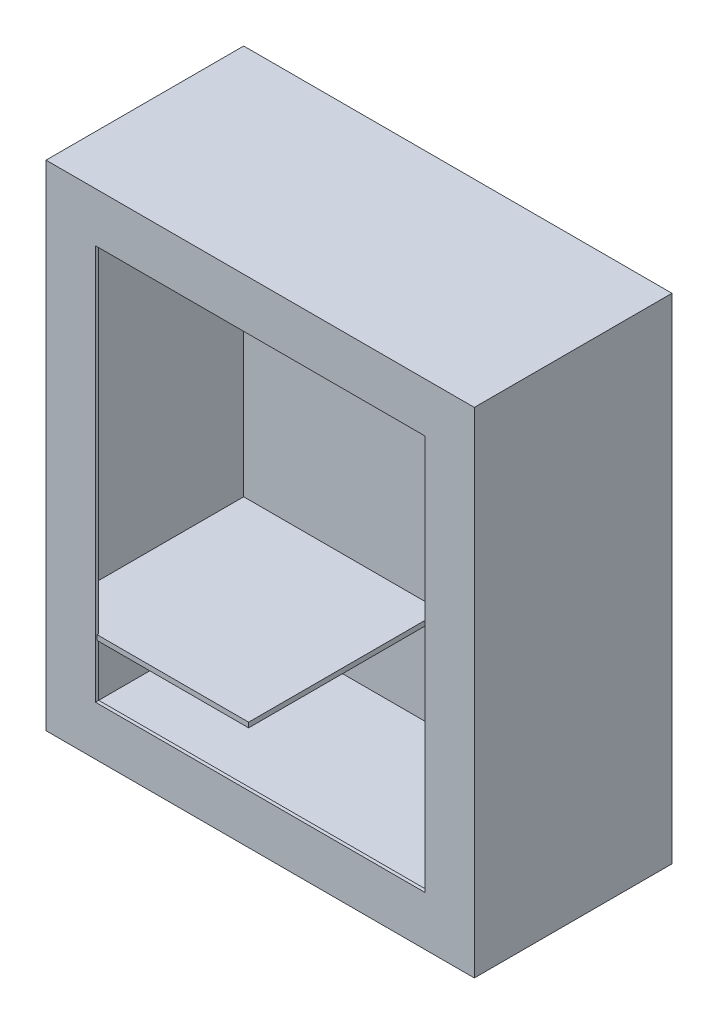
ISO-10303-21;
HEADER;
FILE_DESCRIPTION(('STEP AP214'),'2;1');
FILE_NAME('part.step','',(''),(''),'','','');
FILE_SCHEMA(('AUTOMOTIVE_DESIGN { 1 0 10303 214 1 1 1 1 }'));
ENDSEC;
DATA;
#1=APPLICATION_CONTEXT('core data for automotive mechanical design processes');
#2=APPLICATION_PROTOCOL_DEFINITION('international standard','automotive_design',2000,#1);
#3=PRODUCT_CONTEXT('',#1,'mechanical');
#4=PRODUCT('Part','Part','',(#3));
#5=PRODUCT_RELATED_PRODUCT_CATEGORY('part','',(#4));
#6=PRODUCT_DEFINITION_FORMATION('','',#4);
#7=PRODUCT_DEFINITION_CONTEXT('part definition',#1,'design');
#8=PRODUCT_DEFINITION('design','',#6,#7);
#9=PRODUCT_DEFINITION_SHAPE('','',#8);
#10=(LENGTH_UNIT() NAMED_UNIT(*) SI_UNIT(.MILLI.,.METRE.));
#11=(NAMED_UNIT(*) PLANE_ANGLE_UNIT() SI_UNIT($,.RADIAN.));
#12=(NAMED_UNIT(*) SI_UNIT($,.STERADIAN.) SOLID_ANGLE_UNIT());
#13=UNCERTAINTY_MEASURE_WITH_UNIT(LENGTH_MEASURE(1.E-05),#10,'distance_accuracy_value','');
#14=(GEOMETRIC_REPRESENTATION_CONTEXT(3) GLOBAL_UNCERTAINTY_ASSIGNED_CONTEXT((#13)) GLOBAL_UNIT_ASSIGNED_CONTEXT((#10,
#11,#12)) REPRESENTATION_CONTEXT('',''));
#15=CARTESIAN_POINT('',(0.,0.,0.));
#16=DIRECTION('',(0.,0.,1.));
#17=DIRECTION('',(1.,0.,0.));
#18=AXIS2_PLACEMENT_3D('',#15,#16,#17);
#19=CARTESIAN_POINT('',(-100.,120.,118.));
#20=DIRECTION('',(-1.,0.,0.));
#21=DIRECTION('',(0.,-1.,0.));
#22=AXIS2_PLACEMENT_3D('',#19,#20,#21);
#23=PLANE('',#22);
#24=DIRECTION('',(0.,0.,1.));
#25=VECTOR('',#24,1.);
#26=CARTESIAN_POINT('',(-100.,-85.,118.));
#27=LINE('',#26,#25);
#28=CARTESIAN_POINT('',(-100.,-85.,118.));
#29=VERTEX_POINT('',#28);
#30=CARTESIAN_POINT('',(-100.,-85.,119.));
#31=VERTEX_POINT('',#30);
#32=EDGE_CURVE('E221',#29,#31,#27,.T.);
#33=ORIENTED_EDGE('',*,*,#32,.F.);
#34=DIRECTION('',(0.,-1.,0.));
#35=VECTOR('',#34,1.);
#36=CARTESIAN_POINT('',(-100.,120.,118.));
#37=LINE('',#36,#35);
#38=CARTESIAN_POINT('',(-100.,120.,118.));
#39=VERTEX_POINT('',#38);
#40=EDGE_CURVE('E269',#39,#29,#37,.T.);
#41=ORIENTED_EDGE('',*,*,#40,.F.);
#42=DIRECTION('',(0.,0.,1.));
#43=VECTOR('',#42,1.);
#44=CARTESIAN_POINT('',(-100.,120.,118.));
#45=LINE('',#44,#43);
#46=CARTESIAN_POINT('',(-100.,120.,120.));
#47=VERTEX_POINT('',#46);
#48=EDGE_CURVE('E298',#39,#47,#45,.T.);
#49=ORIENTED_EDGE('',*,*,#48,.T.);
#50=DIRECTION('',(0.,-1.,0.));
#51=VECTOR('',#50,1.);
#52=CARTESIAN_POINT('',(-100.,120.,120.));
#53=LINE('',#52,#51);
#54=CARTESIAN_POINT('',(-100.,-120.,120.));
#55=VERTEX_POINT('',#54);
#56=EDGE_CURVE('E259',#47,#55,#53,.T.);
#57=ORIENTED_EDGE('',*,*,#56,.T.);
#58=DIRECTION('',(0.,0.,1.));
#59=VECTOR('',#58,1.);
#60=CARTESIAN_POINT('',(-100.,-120.,118.));
#61=LINE('',#60,#59);
#62=CARTESIAN_POINT('',(-100.,-120.,118.));
#63=VERTEX_POINT('',#62);
#64=EDGE_CURVE('E283',#63,#55,#61,.T.);
#65=ORIENTED_EDGE('',*,*,#64,.F.);
#66=CARTESIAN_POINT('',(-100.,-88.0000000000001,118.));
#67=VERTEX_POINT('',#66);
#68=EDGE_CURVE('E274',#67,#63,#37,.T.);
#69=ORIENTED_EDGE('',*,*,#68,.F.);
#70=DIRECTION('',(0.,0.,-1.));
#71=VECTOR('',#70,1.);
#72=CARTESIAN_POINT('',(-100.,-88.,118.));
#73=LINE('',#72,#71);
#74=CARTESIAN_POINT('',(-100.,-88.,119.));
#75=VERTEX_POINT('',#74);
#76=EDGE_CURVE('E58',#75,#67,#73,.T.);
#77=ORIENTED_EDGE('',*,*,#76,.F.);
#78=DIRECTION('',(0.,-1.,0.));
#79=VECTOR('',#78,1.);
#80=CARTESIAN_POINT('',(-100.,120.,119.));
#81=LINE('',#80,#79);
#82=EDGE_CURVE('E11',#31,#75,#81,.T.);
#83=ORIENTED_EDGE('',*,*,#82,.F.);
#84=EDGE_LOOP('',(#33,#41,#49,#57,#65,#69,#77,#83));
#85=FACE_BOUND('',#84,.T.);
#86=ADVANCED_FACE('F39',(#85),#23,.F.);
#87=CARTESIAN_POINT('',(0.,0.,118.));
#88=DIRECTION('',(0.,0.,-1.));
#89=DIRECTION('',(-1.,0.,0.));
#90=AXIS2_PLACEMENT_3D('',#87,#88,#89);
#91=PLANE('',#90);
#92=ORIENTED_EDGE('',*,*,#40,.T.);
#93=DIRECTION('',(-1.,0.,0.));
#94=VECTOR('',#93,1.);
#95=CARTESIAN_POINT('',(0.,-85.,118.));
#96=LINE('',#95,#94);
#97=CARTESIAN_POINT('',(-128.,-85.,118.));
#98=VERTEX_POINT('',#97);
#99=EDGE_CURVE('E218',#29,#98,#96,.T.);
#100=ORIENTED_EDGE('',*,*,#99,.T.);
#101=DIRECTION('',(0.,-1.,0.));
#102=VECTOR('',#101,1.);
#103=CARTESIAN_POINT('',(-128.,148.,118.));
#104=LINE('',#103,#102);
#105=CARTESIAN_POINT('',(-128.,148.,118.));
#106=VERTEX_POINT('',#105);
#107=EDGE_CURVE('E240',#106,#98,#104,.T.);
#108=ORIENTED_EDGE('',*,*,#107,.F.);
#109=DIRECTION('',(-1.,0.,0.));
#110=VECTOR('',#109,1.);
#111=CARTESIAN_POINT('',(128.,148.,118.));
#112=LINE('',#111,#110);
#113=CARTESIAN_POINT('',(128.,148.,118.));
#114=VERTEX_POINT('',#113);
#115=EDGE_CURVE('E252',#114,#106,#112,.T.);
#116=ORIENTED_EDGE('',*,*,#115,.F.);
#117=DIRECTION('',(0.,1.,0.));
#118=VECTOR('',#117,1.);
#119=CARTESIAN_POINT('',(128.,148.,118.));
#120=LINE('',#119,#118);
#121=CARTESIAN_POINT('',(128.,-148.,118.));
#122=VERTEX_POINT('',#121);
#123=EDGE_CURVE('E248',#122,#114,#120,.T.);
#124=ORIENTED_EDGE('',*,*,#123,.F.);
#125=DIRECTION('',(1.,0.,0.));
#126=VECTOR('',#125,1.);
#127=CARTESIAN_POINT('',(128.,-148.,118.));
#128=LINE('',#127,#126);
#129=CARTESIAN_POINT('',(-128.,-148.,118.));
#130=VERTEX_POINT('',#129);
#131=EDGE_CURVE('E244',#130,#122,#128,.T.);
#132=ORIENTED_EDGE('',*,*,#131,.F.);
#133=CARTESIAN_POINT('',(-128.,-88.,118.));
#134=VERTEX_POINT('',#133);
#135=EDGE_CURVE('E224',#134,#130,#104,.T.);
#136=ORIENTED_EDGE('',*,*,#135,.F.);
#137=DIRECTION('',(1.,0.,0.));
#138=VECTOR('',#137,1.);
#139=CARTESIAN_POINT('',(0.,-88.,118.));
#140=LINE('',#139,#138);
#141=EDGE_CURVE('E174',#134,#67,#140,.T.);
#142=ORIENTED_EDGE('',*,*,#141,.T.);
#143=ORIENTED_EDGE('',*,*,#68,.T.);
#144=DIRECTION('',(1.,0.,0.));
#145=VECTOR('',#144,1.);
#146=CARTESIAN_POINT('',(100.,-120.,118.));
#147=LINE('',#146,#145);
#148=CARTESIAN_POINT('',(100.,-120.,118.));
#149=VERTEX_POINT('',#148);
#150=EDGE_CURVE('E273',#63,#149,#147,.T.);
#151=ORIENTED_EDGE('',*,*,#150,.T.);
#152=DIRECTION('',(0.,1.,0.));
#153=VECTOR('',#152,1.);
#154=CARTESIAN_POINT('',(100.,120.,118.));
#155=LINE('',#154,#153);
#156=CARTESIAN_POINT('',(100.,120.,118.));
#157=VERTEX_POINT('',#156);
#158=EDGE_CURVE('E277',#149,#157,#155,.T.);
#159=ORIENTED_EDGE('',*,*,#158,.T.);
#160=DIRECTION('',(-1.,0.,0.));
#161=VECTOR('',#160,1.);
#162=CARTESIAN_POINT('',(100.,120.,118.));
#163=LINE('',#162,#161);
#164=EDGE_CURVE('E280',#157,#39,#163,.T.);
#165=ORIENTED_EDGE('',*,*,#164,.T.);
#166=EDGE_LOOP('',(#92,#100,#108,#116,#124,#132,#136,#142,#143,#151,#159,#165));
#167=FACE_BOUND('',#166,.T.);
#168=ADVANCED_FACE('F383',(#167),#91,.T.);
#169=CARTESIAN_POINT('',(-128.,148.,2.));
#170=DIRECTION('',(-1.,0.,0.));
#171=DIRECTION('',(0.,-1.,0.));
#172=AXIS2_PLACEMENT_3D('',#169,#170,#171);
#173=PLANE('',#172);
#174=DIRECTION('',(0.,0.,1.));
#175=VECTOR('',#174,1.);
#176=CARTESIAN_POINT('',(-128.,-85.,2.));
#177=LINE('',#176,#175);
#178=CARTESIAN_POINT('',(-128.,-85.,2.));
#179=VERTEX_POINT('',#178);
#180=EDGE_CURVE('E196',#179,#98,#177,.T.);
#181=ORIENTED_EDGE('',*,*,#180,.F.);
#182=DIRECTION('',(0.,-1.,0.));
#183=VECTOR('',#182,1.);
#184=CARTESIAN_POINT('',(-128.,148.,2.));
#185=LINE('',#184,#183);
#186=CARTESIAN_POINT('',(-128.,148.,2.));
#187=VERTEX_POINT('',#186);
#188=EDGE_CURVE('E170',#187,#179,#185,.T.);
#189=ORIENTED_EDGE('',*,*,#188,.F.);
#190=DIRECTION('',(0.,0.,1.));
#191=VECTOR('',#190,1.);
#192=CARTESIAN_POINT('',(-128.,148.,2.));
#193=LINE('',#192,#191);
#194=EDGE_CURVE('E256',#187,#106,#193,.T.);
#195=ORIENTED_EDGE('',*,*,#194,.T.);
#196=ORIENTED_EDGE('',*,*,#107,.T.);
#197=EDGE_LOOP('',(#181,#189,#195,#196));
#198=FACE_BOUND('',#197,.T.);
#199=ADVANCED_FACE('F388',(#198),#173,.F.);
#200=DIRECTION('',(0.,0.,-1.));
#201=VECTOR('',#200,1.);
#202=CARTESIAN_POINT('',(-128.,-88.,2.));
#203=LINE('',#202,#201);
#204=CARTESIAN_POINT('',(-128.,-88.0000000000001,2.));
#205=VERTEX_POINT('',#204);
#206=EDGE_CURVE('E192',#134,#205,#203,.T.);
#207=ORIENTED_EDGE('',*,*,#206,.F.);
#208=ORIENTED_EDGE('',*,*,#135,.T.);
#209=DIRECTION('',(0.,0.,1.));
#210=VECTOR('',#209,1.);
#211=CARTESIAN_POINT('',(-128.,-148.,2.));
#212=LINE('',#211,#210);
#213=CARTESIAN_POINT('',(-128.,-148.,2.));
#214=VERTEX_POINT('',#213);
#215=EDGE_CURVE('E239',#214,#130,#212,.T.);
#216=ORIENTED_EDGE('',*,*,#215,.F.);
#217=EDGE_CURVE('E228',#205,#214,#185,.T.);
#218=ORIENTED_EDGE('',*,*,#217,.F.);
#219=EDGE_LOOP('',(#207,#208,#216,#218));
#220=FACE_BOUND('',#219,.T.);
#221=ADVANCED_FACE('F406',(#220),#173,.F.);
#222=CARTESIAN_POINT('',(0.,0.,2.));
#223=DIRECTION('',(0.,0.,-1.));
#224=DIRECTION('',(-1.,0.,0.));
#225=AXIS2_PLACEMENT_3D('',#222,#223,#224);
#226=PLANE('',#225);
#227=DIRECTION('',(-1.,0.,0.));
#228=VECTOR('',#227,1.);
#229=CARTESIAN_POINT('',(-7.99999999999992,-85.,2.));
#230=LINE('',#229,#228);
#231=CARTESIAN_POINT('',(-7.99999999999992,-85.,2.));
#232=VERTEX_POINT('',#231);
#233=EDGE_CURVE('E162',#232,#179,#230,.T.);
#234=ORIENTED_EDGE('',*,*,#233,.F.);
#235=DIRECTION('',(0.,1.,0.));
#236=VECTOR('',#235,1.);
#237=CARTESIAN_POINT('',(-7.99999999999992,-85.,2.));
#238=LINE('',#237,#236);
#239=CARTESIAN_POINT('',(-7.99999999999992,-88.,2.));
#240=VERTEX_POINT('',#239);
#241=EDGE_CURVE('E166',#240,#232,#238,.T.);
#242=ORIENTED_EDGE('',*,*,#241,.F.);
#243=DIRECTION('',(-1.,0.,0.));
#244=VECTOR('',#243,1.);
#245=CARTESIAN_POINT('',(-7.99999999999992,-88.,2.));
#246=LINE('',#245,#244);
#247=EDGE_CURVE('E203',#240,#205,#246,.T.);
#248=ORIENTED_EDGE('',*,*,#247,.T.);
#249=ORIENTED_EDGE('',*,*,#217,.T.);
#250=DIRECTION('',(1.,0.,0.));
#251=VECTOR('',#250,1.);
#252=CARTESIAN_POINT('',(128.,-148.,2.));
#253=LINE('',#252,#251);
#254=CARTESIAN_POINT('',(128.,-148.,2.));
#255=VERTEX_POINT('',#254);
#256=EDGE_CURVE('E227',#214,#255,#253,.T.);
#257=ORIENTED_EDGE('',*,*,#256,.T.);
#258=DIRECTION('',(0.,1.,0.));
#259=VECTOR('',#258,1.);
#260=CARTESIAN_POINT('',(128.,148.,2.));
#261=LINE('',#260,#259);
#262=CARTESIAN_POINT('',(128.,148.,2.));
#263=VERTEX_POINT('',#262);
#264=EDGE_CURVE('E232',#255,#263,#261,.T.);
#265=ORIENTED_EDGE('',*,*,#264,.T.);
#266=DIRECTION('',(-1.,0.,0.));
#267=VECTOR('',#266,1.);
#268=CARTESIAN_POINT('',(128.,148.,2.));
#269=LINE('',#268,#267);
#270=EDGE_CURVE('E236',#263,#187,#269,.T.);
#271=ORIENTED_EDGE('',*,*,#270,.T.);
#272=ORIENTED_EDGE('',*,*,#188,.T.);
#273=EDGE_LOOP('',(#234,#242,#248,#249,#257,#265,#271,#272));
#274=FACE_BOUND('',#273,.T.);
#275=ADVANCED_FACE('F164',(#274),#226,.F.);
#276=CARTESIAN_POINT('',(-130.,150.,120.));
#277=DIRECTION('',(1.,0.,0.));
#278=DIRECTION('',(0.,1.,0.));
#279=AXIS2_PLACEMENT_3D('',#276,#277,#278);
#280=PLANE('',#279);
#281=DIRECTION('',(0.,-1.,0.));
#282=VECTOR('',#281,1.);
#283=CARTESIAN_POINT('',(-130.,150.,0.));
#284=LINE('',#283,#282);
#285=CARTESIAN_POINT('',(-130.,150.,0.));
#286=VERTEX_POINT('',#285);
#287=CARTESIAN_POINT('',(-130.,-150.,0.));
#288=VERTEX_POINT('',#287);
#289=EDGE_CURVE('E301',#286,#288,#284,.T.);
#290=ORIENTED_EDGE('',*,*,#289,.T.);
#291=DIRECTION('',(0.,0.,-1.));
#292=VECTOR('',#291,1.);
#293=CARTESIAN_POINT('',(-130.,-150.,120.));
#294=LINE('',#293,#292);
#295=CARTESIAN_POINT('',(-130.,-150.,120.));
#296=VERTEX_POINT('',#295);
#297=EDGE_CURVE('E48',#296,#288,#294,.T.);
#298=ORIENTED_EDGE('',*,*,#297,.F.);
#299=DIRECTION('',(0.,-1.,0.));
#300=VECTOR('',#299,1.);
#301=CARTESIAN_POINT('',(-130.,150.,120.));
#302=LINE('',#301,#300);
#303=CARTESIAN_POINT('',(-130.,150.,120.));
#304=VERTEX_POINT('',#303);
#305=EDGE_CURVE('E311',#304,#296,#302,.T.);
#306=ORIENTED_EDGE('',*,*,#305,.F.);
#307=DIRECTION('',(0.,0.,-1.));
#308=VECTOR('',#307,1.);
#309=CARTESIAN_POINT('',(-130.,150.,120.));
#310=LINE('',#309,#308);
#311=EDGE_CURVE('E325',#304,#286,#310,.T.);
#312=ORIENTED_EDGE('',*,*,#311,.T.);
#313=EDGE_LOOP('',(#290,#298,#306,#312));
#314=FACE_BOUND('',#313,.T.);
#315=ADVANCED_FACE('F41',(#314),#280,.F.);
#316=CARTESIAN_POINT('',(130.,-150.,120.));
#317=DIRECTION('',(0.,1.,0.));
#318=DIRECTION('',(0.,0.,1.));
#319=AXIS2_PLACEMENT_3D('',#316,#317,#318);
#320=PLANE('',#319);
#321=DIRECTION('',(1.,0.,0.));
#322=VECTOR('',#321,1.);
#323=CARTESIAN_POINT('',(130.,-150.,0.));
#324=LINE('',#323,#322);
#325=CARTESIAN_POINT('',(130.,-150.,0.));
#326=VERTEX_POINT('',#325);
#327=EDGE_CURVE('E329',#288,#326,#324,.T.);
#328=ORIENTED_EDGE('',*,*,#327,.T.);
#329=DIRECTION('',(0.,0.,-1.));
#330=VECTOR('',#329,1.);
#331=CARTESIAN_POINT('',(130.,-150.,120.));
#332=LINE('',#331,#330);
#333=CARTESIAN_POINT('',(130.,-150.,120.));
#334=VERTEX_POINT('',#333);
#335=EDGE_CURVE('E344',#334,#326,#332,.T.);
#336=ORIENTED_EDGE('',*,*,#335,.F.);
#337=DIRECTION('',(1.,0.,0.));
#338=VECTOR('',#337,1.);
#339=CARTESIAN_POINT('',(130.,-150.,120.));
#340=LINE('',#339,#338);
#341=EDGE_CURVE('E315',#296,#334,#340,.T.);
#342=ORIENTED_EDGE('',*,*,#341,.F.);
#343=ORIENTED_EDGE('',*,*,#297,.T.);
#344=EDGE_LOOP('',(#328,#336,#342,#343));
#345=FACE_BOUND('',#344,.T.);
#346=ADVANCED_FACE('F351',(#345),#320,.F.);
#347=CARTESIAN_POINT('',(130.,150.,120.));
#348=DIRECTION('',(-1.,0.,0.));
#349=DIRECTION('',(0.,-1.,0.));
#350=AXIS2_PLACEMENT_3D('',#347,#348,#349);
#351=PLANE('',#350);
#352=DIRECTION('',(0.,1.,0.));
#353=VECTOR('',#352,1.);
#354=CARTESIAN_POINT('',(130.,150.,0.));
#355=LINE('',#354,#353);
#356=CARTESIAN_POINT('',(130.,150.,0.));
#357=VERTEX_POINT('',#356);
#358=EDGE_CURVE('E332',#326,#357,#355,.T.);
#359=ORIENTED_EDGE('',*,*,#358,.T.);
#360=DIRECTION('',(0.,0.,-1.));
#361=VECTOR('',#360,1.);
#362=CARTESIAN_POINT('',(130.,150.,120.));
#363=LINE('',#362,#361);
#364=CARTESIAN_POINT('',(130.,150.,120.));
#365=VERTEX_POINT('',#364);
#366=EDGE_CURVE('E340',#365,#357,#363,.T.);
#367=ORIENTED_EDGE('',*,*,#366,.F.);
#368=DIRECTION('',(0.,1.,0.));
#369=VECTOR('',#368,1.);
#370=CARTESIAN_POINT('',(130.,150.,120.));
#371=LINE('',#370,#369);
#372=EDGE_CURVE('E319',#334,#365,#371,.T.);
#373=ORIENTED_EDGE('',*,*,#372,.F.);
#374=ORIENTED_EDGE('',*,*,#335,.T.);
#375=EDGE_LOOP('',(#359,#367,#373,#374));
#376=FACE_BOUND('',#375,.T.);
#377=ADVANCED_FACE('F363',(#376),#351,.F.);
#378=CARTESIAN_POINT('',(130.,150.,120.));
#379=DIRECTION('',(0.,-1.,0.));
#380=DIRECTION('',(1.,0.,0.));
#381=AXIS2_PLACEMENT_3D('',#378,#379,#380);
#382=PLANE('',#381);
#383=DIRECTION('',(-1.,0.,0.));
#384=VECTOR('',#383,1.);
#385=CARTESIAN_POINT('',(130.,150.,0.));
#386=LINE('',#385,#384);
#387=EDGE_CURVE('E316',#357,#286,#386,.T.);
#388=ORIENTED_EDGE('',*,*,#387,.T.);
#389=ORIENTED_EDGE('',*,*,#311,.F.);
#390=DIRECTION('',(-1.,0.,0.));
#391=VECTOR('',#390,1.);
#392=CARTESIAN_POINT('',(130.,150.,120.));
#393=LINE('',#392,#391);
#394=EDGE_CURVE('E322',#365,#304,#393,.T.);
#395=ORIENTED_EDGE('',*,*,#394,.F.);
#396=ORIENTED_EDGE('',*,*,#366,.T.);
#397=EDGE_LOOP('',(#388,#389,#395,#396));
#398=FACE_BOUND('',#397,.T.);
#399=ADVANCED_FACE('F367',(#398),#382,.F.);
#400=CARTESIAN_POINT('',(0.,0.,120.));
#401=DIRECTION('',(0.,0.,-1.));
#402=DIRECTION('',(-1.,0.,0.));
#403=AXIS2_PLACEMENT_3D('',#400,#401,#402);
#404=PLANE('',#403);
#405=DIRECTION('',(1.,0.,0.));
#406=VECTOR('',#405,1.);
#407=CARTESIAN_POINT('',(100.,-120.,120.));
#408=LINE('',#407,#406);
#409=CARTESIAN_POINT('',(100.,-120.,120.));
#410=VERTEX_POINT('',#409);
#411=EDGE_CURVE('E286',#55,#410,#408,.T.);
#412=ORIENTED_EDGE('',*,*,#411,.F.);
#413=ORIENTED_EDGE('',*,*,#56,.F.);
#414=DIRECTION('',(-1.,0.,0.));
#415=VECTOR('',#414,1.);
#416=CARTESIAN_POINT('',(100.,120.,120.));
#417=LINE('',#416,#415);
#418=CARTESIAN_POINT('',(100.,120.,120.));
#419=VERTEX_POINT('',#418);
#420=EDGE_CURVE('E294',#419,#47,#417,.T.);
#421=ORIENTED_EDGE('',*,*,#420,.F.);
#422=DIRECTION('',(0.,1.,0.));
#423=VECTOR('',#422,1.);
#424=CARTESIAN_POINT('',(100.,120.,120.));
#425=LINE('',#424,#423);
#426=EDGE_CURVE('E290',#410,#419,#425,.T.);
#427=ORIENTED_EDGE('',*,*,#426,.F.);
#428=EDGE_LOOP('',(#412,#413,#421,#427));
#429=FACE_BOUND('',#428,.T.);
#430=ORIENTED_EDGE('',*,*,#305,.T.);
#431=ORIENTED_EDGE('',*,*,#341,.T.);
#432=ORIENTED_EDGE('',*,*,#372,.T.);
#433=ORIENTED_EDGE('',*,*,#394,.T.);
#434=EDGE_LOOP('',(#430,#431,#432,#433));
#435=FACE_BOUND('',#434,.T.);
#436=ADVANCED_FACE('F369',(#429,#435),#404,.F.);
#437=CARTESIAN_POINT('',(0.,0.,0.));
#438=DIRECTION('',(0.,0.,-1.));
#439=DIRECTION('',(-1.,0.,0.));
#440=AXIS2_PLACEMENT_3D('',#437,#438,#439);
#441=PLANE('',#440);
#442=ORIENTED_EDGE('',*,*,#289,.F.);
#443=ORIENTED_EDGE('',*,*,#387,.F.);
#444=ORIENTED_EDGE('',*,*,#358,.F.);
#445=ORIENTED_EDGE('',*,*,#327,.F.);
#446=EDGE_LOOP('',(#442,#443,#444,#445));
#447=FACE_BOUND('',#446,.T.);
#448=ADVANCED_FACE('F359',(#447),#441,.T.);
#449=CARTESIAN_POINT('',(100.,120.,118.));
#450=DIRECTION('',(0.,1.,0.));
#451=DIRECTION('',(-1.,0.,0.));
#452=AXIS2_PLACEMENT_3D('',#449,#450,#451);
#453=PLANE('',#452);
#454=ORIENTED_EDGE('',*,*,#420,.T.);
#455=ORIENTED_EDGE('',*,*,#48,.F.);
#456=ORIENTED_EDGE('',*,*,#164,.F.);
#457=DIRECTION('',(0.,0.,1.));
#458=VECTOR('',#457,1.);
#459=CARTESIAN_POINT('',(100.,120.,118.));
#460=LINE('',#459,#458);
#461=EDGE_CURVE('E302',#157,#419,#460,.T.);
#462=ORIENTED_EDGE('',*,*,#461,.T.);
#463=EDGE_LOOP('',(#454,#455,#456,#462));
#464=FACE_BOUND('',#463,.T.);
#465=ADVANCED_FACE('F377',(#464),#453,.F.);
#466=CARTESIAN_POINT('',(100.,120.,118.));
#467=DIRECTION('',(1.,0.,0.));
#468=DIRECTION('',(0.,1.,0.));
#469=AXIS2_PLACEMENT_3D('',#466,#467,#468);
#470=PLANE('',#469);
#471=ORIENTED_EDGE('',*,*,#426,.T.);
#472=ORIENTED_EDGE('',*,*,#461,.F.);
#473=ORIENTED_EDGE('',*,*,#158,.F.);
#474=DIRECTION('',(0.,0.,1.));
#475=VECTOR('',#474,1.);
#476=CARTESIAN_POINT('',(100.,-120.,118.));
#477=LINE('',#476,#475);
#478=EDGE_CURVE('E305',#149,#410,#477,.T.);
#479=ORIENTED_EDGE('',*,*,#478,.T.);
#480=EDGE_LOOP('',(#471,#472,#473,#479));
#481=FACE_BOUND('',#480,.T.);
#482=ADVANCED_FACE('F396',(#481),#470,.F.);
#483=CARTESIAN_POINT('',(100.,-120.,118.));
#484=DIRECTION('',(0.,-1.,0.));
#485=DIRECTION('',(1.,0.,0.));
#486=AXIS2_PLACEMENT_3D('',#483,#484,#485);
#487=PLANE('',#486);
#488=ORIENTED_EDGE('',*,*,#411,.T.);
#489=ORIENTED_EDGE('',*,*,#478,.F.);
#490=ORIENTED_EDGE('',*,*,#150,.F.);
#491=ORIENTED_EDGE('',*,*,#64,.T.);
#492=EDGE_LOOP('',(#488,#489,#490,#491));
#493=FACE_BOUND('',#492,.T.);
#494=ADVANCED_FACE('F392',(#493),#487,.F.);
#495=CARTESIAN_POINT('',(128.,148.,2.));
#496=DIRECTION('',(0.,1.,0.));
#497=DIRECTION('',(-1.,0.,0.));
#498=AXIS2_PLACEMENT_3D('',#495,#496,#497);
#499=PLANE('',#498);
#500=ORIENTED_EDGE('',*,*,#115,.T.);
#501=ORIENTED_EDGE('',*,*,#194,.F.);
#502=ORIENTED_EDGE('',*,*,#270,.F.);
#503=DIRECTION('',(0.,0.,1.));
#504=VECTOR('',#503,1.);
#505=CARTESIAN_POINT('',(128.,148.,2.));
#506=LINE('',#505,#504);
#507=EDGE_CURVE('E260',#263,#114,#506,.T.);
#508=ORIENTED_EDGE('',*,*,#507,.T.);
#509=EDGE_LOOP('',(#500,#501,#502,#508));
#510=FACE_BOUND('',#509,.T.);
#511=ADVANCED_FACE('F395',(#510),#499,.F.);
#512=CARTESIAN_POINT('',(128.,148.,2.));
#513=DIRECTION('',(1.,0.,0.));
#514=DIRECTION('',(0.,0.,-1.));
#515=AXIS2_PLACEMENT_3D('',#512,#513,#514);
#516=PLANE('',#515);
#517=ORIENTED_EDGE('',*,*,#123,.T.);
#518=ORIENTED_EDGE('',*,*,#507,.F.);
#519=ORIENTED_EDGE('',*,*,#264,.F.);
#520=DIRECTION('',(0.,0.,1.));
#521=VECTOR('',#520,1.);
#522=CARTESIAN_POINT('',(128.,-148.,2.));
#523=LINE('',#522,#521);
#524=EDGE_CURVE('E263',#255,#122,#523,.T.);
#525=ORIENTED_EDGE('',*,*,#524,.T.);
#526=EDGE_LOOP('',(#517,#518,#519,#525));
#527=FACE_BOUND('',#526,.T.);
#528=ADVANCED_FACE('F412',(#527),#516,.F.);
#529=CARTESIAN_POINT('',(128.,-148.,2.));
#530=DIRECTION('',(0.,-1.,0.));
#531=DIRECTION('',(1.,0.,0.));
#532=AXIS2_PLACEMENT_3D('',#529,#530,#531);
#533=PLANE('',#532);
#534=ORIENTED_EDGE('',*,*,#131,.T.);
#535=ORIENTED_EDGE('',*,*,#524,.F.);
#536=ORIENTED_EDGE('',*,*,#256,.F.);
#537=ORIENTED_EDGE('',*,*,#215,.T.);
#538=EDGE_LOOP('',(#534,#535,#536,#537));
#539=FACE_BOUND('',#538,.T.);
#540=ADVANCED_FACE('F408',(#539),#533,.F.);
#541=CARTESIAN_POINT('',(-7.99999999999992,-85.,119.));
#542=DIRECTION('',(0.,0.,-1.));
#543=DIRECTION('',(-1.,0.,0.));
#544=AXIS2_PLACEMENT_3D('',#541,#542,#543);
#545=PLANE('',#544);
#546=DIRECTION('',(-1.,0.,0.));
#547=VECTOR('',#546,1.);
#548=CARTESIAN_POINT('',(-7.99999999999992,-85.,119.));
#549=LINE('',#548,#547);
#550=CARTESIAN_POINT('',(-7.99999999999992,-85.,119.));
#551=VERTEX_POINT('',#550);
#552=EDGE_CURVE('E175',#551,#31,#549,.T.);
#553=ORIENTED_EDGE('',*,*,#552,.T.);
#554=ORIENTED_EDGE('',*,*,#82,.T.);
#555=DIRECTION('',(-1.,0.,0.));
#556=VECTOR('',#555,1.);
#557=CARTESIAN_POINT('',(-7.99999999999992,-88.,119.));
#558=LINE('',#557,#556);
#559=CARTESIAN_POINT('',(-7.99999999999992,-88.,119.));
#560=VERTEX_POINT('',#559);
#561=EDGE_CURVE('E208',#560,#75,#558,.T.);
#562=ORIENTED_EDGE('',*,*,#561,.F.);
#563=DIRECTION('',(0.,-1.,0.));
#564=VECTOR('',#563,1.);
#565=CARTESIAN_POINT('',(-7.99999999999992,-85.,119.));
#566=LINE('',#565,#564);
#567=EDGE_CURVE('E185',#551,#560,#566,.T.);
#568=ORIENTED_EDGE('',*,*,#567,.F.);
#569=EDGE_LOOP('',(#553,#554,#562,#568));
#570=FACE_BOUND('',#569,.T.);
#571=ADVANCED_FACE('F411',(#570),#545,.F.);
#572=CARTESIAN_POINT('',(-7.99999999999992,-85.,2.));
#573=DIRECTION('',(0.,-1.,0.));
#574=DIRECTION('',(1.,0.,0.));
#575=AXIS2_PLACEMENT_3D('',#572,#573,#574);
#576=PLANE('',#575);
#577=ORIENTED_EDGE('',*,*,#99,.F.);
#578=ORIENTED_EDGE('',*,*,#32,.T.);
#579=ORIENTED_EDGE('',*,*,#552,.F.);
#580=DIRECTION('',(0.,0.,1.));
#581=VECTOR('',#580,1.);
#582=CARTESIAN_POINT('',(-7.99999999999992,-85.,2.));
#583=LINE('',#582,#581);
#584=EDGE_CURVE('E178',#232,#551,#583,.T.);
#585=ORIENTED_EDGE('',*,*,#584,.F.);
#586=ORIENTED_EDGE('',*,*,#233,.T.);
#587=ORIENTED_EDGE('',*,*,#180,.T.);
#588=EDGE_LOOP('',(#577,#578,#579,#585,#586,#587));
#589=FACE_BOUND('',#588,.T.);
#590=ADVANCED_FACE('F180',(#589),#576,.F.);
#591=CARTESIAN_POINT('',(-7.99999999999992,-88.,2.));
#592=DIRECTION('',(0.,1.,0.));
#593=DIRECTION('',(-1.,0.,0.));
#594=AXIS2_PLACEMENT_3D('',#591,#592,#593);
#595=PLANE('',#594);
#596=ORIENTED_EDGE('',*,*,#561,.T.);
#597=ORIENTED_EDGE('',*,*,#76,.T.);
#598=ORIENTED_EDGE('',*,*,#141,.F.);
#599=ORIENTED_EDGE('',*,*,#206,.T.);
#600=ORIENTED_EDGE('',*,*,#247,.F.);
#601=DIRECTION('',(0.,0.,-1.));
#602=VECTOR('',#601,1.);
#603=CARTESIAN_POINT('',(-7.99999999999992,-88.,2.));
#604=LINE('',#603,#602);
#605=EDGE_CURVE('E189',#560,#240,#604,.T.);
#606=ORIENTED_EDGE('',*,*,#605,.F.);
#607=EDGE_LOOP('',(#596,#597,#598,#599,#600,#606));
#608=FACE_BOUND('',#607,.T.);
#609=ADVANCED_FACE('F424',(#608),#595,.F.);
#610=CARTESIAN_POINT('',(-7.99999999999992,0.,0.));
#611=DIRECTION('',(-1.,0.,0.));
#612=DIRECTION('',(0.,0.,1.));
#613=AXIS2_PLACEMENT_3D('',#610,#611,#612);
#614=PLANE('',#613);
#615=ORIENTED_EDGE('',*,*,#241,.T.);
#616=ORIENTED_EDGE('',*,*,#584,.T.);
#617=ORIENTED_EDGE('',*,*,#567,.T.);
#618=ORIENTED_EDGE('',*,*,#605,.T.);
#619=EDGE_LOOP('',(#615,#616,#617,#618));
#620=FACE_BOUND('',#619,.T.);
#621=ADVANCED_FACE('F187',(#620),#614,.F.);
#622=CLOSED_SHELL('',(#86,#168,#199,#221,#275,#315,#346,#377,#399,#436,#448,#465,#482,#494,#511,
#528,#540,#571,#590,#609,#621));
#623=MANIFOLD_SOLID_BREP('B2',#622);
#624=ADVANCED_BREP_SHAPE_REPRESENTATION('',(#18,#623),#14);
#625=SHAPE_DEFINITION_REPRESENTATION(#9,#624);
ENDSEC;
END-ISO-10303-21;
